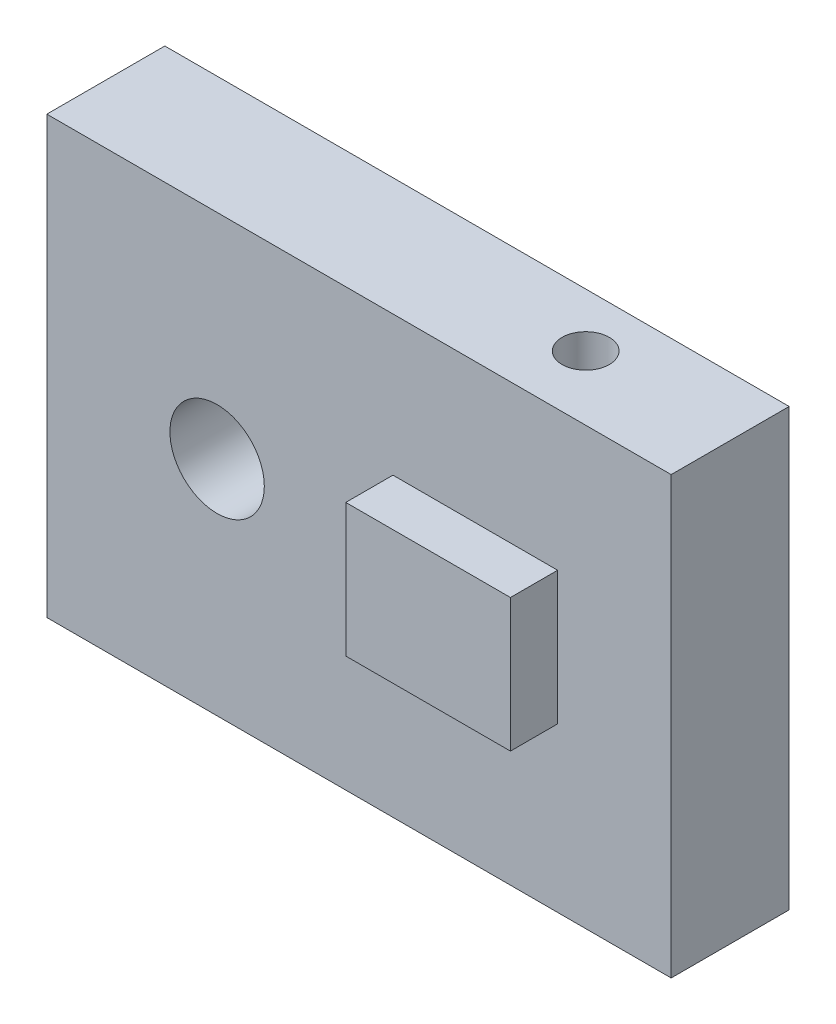
ISO-10303-21;
HEADER;
FILE_DESCRIPTION(('STEP AP214'),'2;1');
FILE_NAME('part.step','',(''),(''),'','','');
FILE_SCHEMA(('AUTOMOTIVE_DESIGN { 1 0 10303 214 1 1 1 1 }'));
ENDSEC;
DATA;
#1=APPLICATION_CONTEXT('core data for automotive mechanical design processes');
#2=APPLICATION_PROTOCOL_DEFINITION('international standard','automotive_design',2000,#1);
#3=PRODUCT_CONTEXT('',#1,'mechanical');
#4=PRODUCT('Part','Part','',(#3));
#5=PRODUCT_RELATED_PRODUCT_CATEGORY('part','',(#4));
#6=PRODUCT_DEFINITION_FORMATION('','',#4);
#7=PRODUCT_DEFINITION_CONTEXT('part definition',#1,'design');
#8=PRODUCT_DEFINITION('design','',#6,#7);
#9=PRODUCT_DEFINITION_SHAPE('','',#8);
#10=(LENGTH_UNIT() NAMED_UNIT(*) SI_UNIT(.MILLI.,.METRE.));
#11=(NAMED_UNIT(*) PLANE_ANGLE_UNIT() SI_UNIT($,.RADIAN.));
#12=(NAMED_UNIT(*) SI_UNIT($,.STERADIAN.) SOLID_ANGLE_UNIT());
#13=UNCERTAINTY_MEASURE_WITH_UNIT(LENGTH_MEASURE(1.E-05),#10,'distance_accuracy_value','');
#14=(GEOMETRIC_REPRESENTATION_CONTEXT(3) GLOBAL_UNCERTAINTY_ASSIGNED_CONTEXT((#13)) GLOBAL_UNIT_ASSIGNED_CONTEXT((#10,
#11,#12)) REPRESENTATION_CONTEXT('',''));
#15=CARTESIAN_POINT('',(0.,0.,0.));
#16=DIRECTION('',(0.,0.,1.));
#17=DIRECTION('',(1.,0.,0.));
#18=AXIS2_PLACEMENT_3D('',#15,#16,#17);
#19=CARTESIAN_POINT('',(0.,0.,25.));
#20=DIRECTION('',(0.,0.,1.));
#21=DIRECTION('',(1.,0.,0.));
#22=AXIS2_PLACEMENT_3D('',#19,#20,#21);
#23=PLANE('',#22);
#24=CARTESIAN_POINT('',(-30.0599732705231,0.936294249409827,25.));
#25=DIRECTION('',(0.,0.,1.));
#26=DIRECTION('',(1.,0.,0.));
#27=AXIS2_PLACEMENT_3D('',#24,#25,#26);
#28=CIRCLE('',#27,10.);
#29=CARTESIAN_POINT('',(-20.0599732705231,0.936294249409827,25.));
#30=VERTEX_POINT('',#29);
#31=EDGE_CURVE('E156',#30,#30,#28,.T.);
#32=ORIENTED_EDGE('',*,*,#31,.F.);
#33=EDGE_LOOP('',(#32));
#34=FACE_BOUND('',#33,.T.);
#35=DIRECTION('',(0.,1.,0.));
#36=VECTOR('',#35,1.);
#37=CARTESIAN_POINT('',(66.1380194985695,46.1841977518339,25.));
#38=LINE('',#37,#36);
#39=CARTESIAN_POINT('',(66.1380194985695,-46.1841977518339,25.));
#40=VERTEX_POINT('',#39);
#41=CARTESIAN_POINT('',(66.1380194985695,46.1841977518339,25.));
#42=VERTEX_POINT('',#41);
#43=EDGE_CURVE('E163',#40,#42,#38,.T.);
#44=ORIENTED_EDGE('',*,*,#43,.T.);
#45=DIRECTION('',(-1.,0.,0.));
#46=VECTOR('',#45,1.);
#47=CARTESIAN_POINT('',(-66.1380194985695,46.1841977518339,25.));
#48=LINE('',#47,#46);
#49=CARTESIAN_POINT('',(-66.1380194985695,46.1841977518339,25.));
#50=VERTEX_POINT('',#49);
#51=EDGE_CURVE('E99',#42,#50,#48,.T.);
#52=ORIENTED_EDGE('',*,*,#51,.T.);
#53=DIRECTION('',(0.,-1.,0.));
#54=VECTOR('',#53,1.);
#55=CARTESIAN_POINT('',(-66.1380194985695,46.1841977518339,25.));
#56=LINE('',#55,#54);
#57=CARTESIAN_POINT('',(-66.1380194985695,-46.1841977518339,25.));
#58=VERTEX_POINT('',#57);
#59=EDGE_CURVE('E166',#50,#58,#56,.T.);
#60=ORIENTED_EDGE('',*,*,#59,.T.);
#61=DIRECTION('',(1.,0.,0.));
#62=VECTOR('',#61,1.);
#63=CARTESIAN_POINT('',(-66.1380194985695,-46.1841977518339,25.));
#64=LINE('',#63,#62);
#65=EDGE_CURVE('E71',#58,#40,#64,.T.);
#66=ORIENTED_EDGE('',*,*,#65,.T.);
#67=EDGE_LOOP('',(#44,#52,#60,#66));
#68=FACE_BOUND('',#67,.T.);
#69=DIRECTION('',(-1.,0.,0.));
#70=VECTOR('',#69,1.);
#71=CARTESIAN_POINT('',(7.19468212704327,16.6069032658465,25.));
#72=LINE('',#71,#70);
#73=CARTESIAN_POINT('',(42.0839625787323,16.6069032658465,25.));
#74=VERTEX_POINT('',#73);
#75=CARTESIAN_POINT('',(7.19468212704327,16.6069032658465,25.));
#76=VERTEX_POINT('',#75);
#77=EDGE_CURVE('E324',#74,#76,#72,.T.);
#78=ORIENTED_EDGE('',*,*,#77,.F.);
#79=DIRECTION('',(0.,1.,0.));
#80=VECTOR('',#79,1.);
#81=CARTESIAN_POINT('',(42.0839625787323,16.6069032658465,25.));
#82=LINE('',#81,#80);
#83=CARTESIAN_POINT('',(42.0839625787323,-11.5804815058572,25.));
#84=VERTEX_POINT('',#83);
#85=EDGE_CURVE('E144',#84,#74,#82,.T.);
#86=ORIENTED_EDGE('',*,*,#85,.F.);
#87=DIRECTION('',(1.,0.,0.));
#88=VECTOR('',#87,1.);
#89=CARTESIAN_POINT('',(7.19468212704327,-11.5804815058572,25.));
#90=LINE('',#89,#88);
#91=CARTESIAN_POINT('',(7.19468212704327,-11.5804815058572,25.));
#92=VERTEX_POINT('',#91);
#93=EDGE_CURVE('E140',#92,#84,#90,.T.);
#94=ORIENTED_EDGE('',*,*,#93,.F.);
#95=DIRECTION('',(0.,-1.,0.));
#96=VECTOR('',#95,1.);
#97=CARTESIAN_POINT('',(7.19468212704327,16.6069032658465,25.));
#98=LINE('',#97,#96);
#99=EDGE_CURVE('E321',#76,#92,#98,.T.);
#100=ORIENTED_EDGE('',*,*,#99,.F.);
#101=EDGE_LOOP('',(#78,#86,#94,#100));
#102=FACE_BOUND('',#101,.T.);
#103=ADVANCED_FACE('F47',(#34,#68,#102),#23,.T.);
#104=CARTESIAN_POINT('',(66.1380194985695,46.1841977518339,25.));
#105=DIRECTION('',(-1.,0.,0.));
#106=DIRECTION('',(0.,0.,1.));
#107=AXIS2_PLACEMENT_3D('',#104,#105,#106);
#108=PLANE('',#107);
#109=DIRECTION('',(0.,1.,0.));
#110=VECTOR('',#109,1.);
#111=CARTESIAN_POINT('',(66.1380194985695,46.1841977518339,0.));
#112=LINE('',#111,#110);
#113=CARTESIAN_POINT('',(66.1380194985695,-46.1841977518339,0.));
#114=VERTEX_POINT('',#113);
#115=CARTESIAN_POINT('',(66.1380194985695,46.1841977518339,0.));
#116=VERTEX_POINT('',#115);
#117=EDGE_CURVE('E162',#114,#116,#112,.T.);
#118=ORIENTED_EDGE('',*,*,#117,.T.);
#119=DIRECTION('',(0.,0.,-1.));
#120=VECTOR('',#119,1.);
#121=CARTESIAN_POINT('',(66.1380194985695,46.1841977518339,25.));
#122=LINE('',#121,#120);
#123=EDGE_CURVE('E11',#42,#116,#122,.T.);
#124=ORIENTED_EDGE('',*,*,#123,.F.);
#125=ORIENTED_EDGE('',*,*,#43,.F.);
#126=DIRECTION('',(0.,0.,-1.));
#127=VECTOR('',#126,1.);
#128=CARTESIAN_POINT('',(66.1380194985695,-46.1841977518339,25.));
#129=LINE('',#128,#127);
#130=EDGE_CURVE('E169',#40,#114,#129,.T.);
#131=ORIENTED_EDGE('',*,*,#130,.T.);
#132=EDGE_LOOP('',(#118,#124,#125,#131));
#133=FACE_BOUND('',#132,.T.);
#134=ADVANCED_FACE('F49',(#133),#108,.F.);
#135=CARTESIAN_POINT('',(-66.1380194985695,46.1841977518339,25.));
#136=DIRECTION('',(0.,-1.,0.));
#137=DIRECTION('',(0.,0.,-1.));
#138=AXIS2_PLACEMENT_3D('',#135,#136,#137);
#139=PLANE('',#138);
#140=CARTESIAN_POINT('',(34.3964940046314,46.1841977518339,11.3665911717668));
#141=DIRECTION('',(0.,1.,0.));
#142=DIRECTION('',(0.,0.,1.));
#143=AXIS2_PLACEMENT_3D('',#140,#141,#142);
#144=CIRCLE('',#143,5.);
#145=CARTESIAN_POINT('',(34.3964940046314,46.1841977518339,16.3665911717668));
#146=VERTEX_POINT('',#145);
#147=EDGE_CURVE('E146',#146,#146,#144,.T.);
#148=ORIENTED_EDGE('',*,*,#147,.F.);
#149=EDGE_LOOP('',(#148));
#150=FACE_BOUND('',#149,.T.);
#151=DIRECTION('',(-1.,0.,0.));
#152=VECTOR('',#151,1.);
#153=CARTESIAN_POINT('',(-66.1380194985695,46.1841977518339,0.));
#154=LINE('',#153,#152);
#155=CARTESIAN_POINT('',(-66.1380194985695,46.1841977518339,0.));
#156=VERTEX_POINT('',#155);
#157=EDGE_CURVE('E172',#116,#156,#154,.T.);
#158=ORIENTED_EDGE('',*,*,#157,.T.);
#159=DIRECTION('',(0.,0.,-1.));
#160=VECTOR('',#159,1.);
#161=CARTESIAN_POINT('',(-66.1380194985695,46.1841977518339,25.));
#162=LINE('',#161,#160);
#163=EDGE_CURVE('E55',#50,#156,#162,.T.);
#164=ORIENTED_EDGE('',*,*,#163,.F.);
#165=ORIENTED_EDGE('',*,*,#51,.F.);
#166=ORIENTED_EDGE('',*,*,#123,.T.);
#167=EDGE_LOOP('',(#158,#164,#165,#166));
#168=FACE_BOUND('',#167,.T.);
#169=ADVANCED_FACE('F204',(#150,#168),#139,.F.);
#170=CARTESIAN_POINT('',(-66.1380194985695,46.1841977518339,25.));
#171=DIRECTION('',(1.,0.,0.));
#172=DIRECTION('',(0.,0.,-1.));
#173=AXIS2_PLACEMENT_3D('',#170,#171,#172);
#174=PLANE('',#173);
#175=DIRECTION('',(0.,-1.,0.));
#176=VECTOR('',#175,1.);
#177=CARTESIAN_POINT('',(-66.1380194985695,46.1841977518339,0.));
#178=LINE('',#177,#176);
#179=CARTESIAN_POINT('',(-66.1380194985695,-46.1841977518339,0.));
#180=VERTEX_POINT('',#179);
#181=EDGE_CURVE('E174',#156,#180,#178,.T.);
#182=ORIENTED_EDGE('',*,*,#181,.T.);
#183=DIRECTION('',(0.,0.,-1.));
#184=VECTOR('',#183,1.);
#185=CARTESIAN_POINT('',(-66.1380194985695,-46.1841977518339,25.));
#186=LINE('',#185,#184);
#187=EDGE_CURVE('E178',#58,#180,#186,.T.);
#188=ORIENTED_EDGE('',*,*,#187,.F.);
#189=ORIENTED_EDGE('',*,*,#59,.F.);
#190=ORIENTED_EDGE('',*,*,#163,.T.);
#191=EDGE_LOOP('',(#182,#188,#189,#190));
#192=FACE_BOUND('',#191,.T.);
#193=ADVANCED_FACE('F183',(#192),#174,.F.);
#194=CARTESIAN_POINT('',(-66.1380194985695,-46.1841977518339,25.));
#195=DIRECTION('',(0.,1.,0.));
#196=DIRECTION('',(0.,0.,1.));
#197=AXIS2_PLACEMENT_3D('',#194,#195,#196);
#198=PLANE('',#197);
#199=CARTESIAN_POINT('',(34.3964940046314,-46.1841977518339,11.3665911717668));
#200=DIRECTION('',(0.,1.,0.));
#201=DIRECTION('',(0.,0.,1.));
#202=AXIS2_PLACEMENT_3D('',#199,#200,#201);
#203=CIRCLE('',#202,4.99999999999999);
#204=CARTESIAN_POINT('',(34.3964940046314,-46.1841977518339,16.3665911717668));
#205=VERTEX_POINT('',#204);
#206=EDGE_CURVE('E149',#205,#205,#203,.T.);
#207=ORIENTED_EDGE('',*,*,#206,.T.);
#208=EDGE_LOOP('',(#207));
#209=FACE_BOUND('',#208,.T.);
#210=DIRECTION('',(1.,0.,0.));
#211=VECTOR('',#210,1.);
#212=CARTESIAN_POINT('',(-66.1380194985695,-46.1841977518339,0.));
#213=LINE('',#212,#211);
#214=EDGE_CURVE('E92',#180,#114,#213,.T.);
#215=ORIENTED_EDGE('',*,*,#214,.T.);
#216=ORIENTED_EDGE('',*,*,#130,.F.);
#217=ORIENTED_EDGE('',*,*,#65,.F.);
#218=ORIENTED_EDGE('',*,*,#187,.T.);
#219=EDGE_LOOP('',(#215,#216,#217,#218));
#220=FACE_BOUND('',#219,.T.);
#221=ADVANCED_FACE('F191',(#209,#220),#198,.F.);
#222=CARTESIAN_POINT('',(0.,0.,0.));
#223=DIRECTION('',(0.,0.,1.));
#224=DIRECTION('',(1.,0.,0.));
#225=AXIS2_PLACEMENT_3D('',#222,#223,#224);
#226=PLANE('',#225);
#227=CARTESIAN_POINT('',(-30.0599732705231,0.936294249409827,0.));
#228=DIRECTION('',(0.,0.,1.));
#229=DIRECTION('',(1.,0.,0.));
#230=AXIS2_PLACEMENT_3D('',#227,#228,#229);
#231=CIRCLE('',#230,10.);
#232=CARTESIAN_POINT('',(-20.0599732705231,0.936294249409827,0.));
#233=VERTEX_POINT('',#232);
#234=EDGE_CURVE('E159',#233,#233,#231,.T.);
#235=ORIENTED_EDGE('',*,*,#234,.T.);
#236=EDGE_LOOP('',(#235));
#237=FACE_BOUND('',#236,.T.);
#238=ORIENTED_EDGE('',*,*,#117,.F.);
#239=ORIENTED_EDGE('',*,*,#214,.F.);
#240=ORIENTED_EDGE('',*,*,#181,.F.);
#241=ORIENTED_EDGE('',*,*,#157,.F.);
#242=EDGE_LOOP('',(#238,#239,#240,#241));
#243=FACE_BOUND('',#242,.T.);
#244=ADVANCED_FACE('F187',(#237,#243),#226,.F.);
#245=CARTESIAN_POINT('',(-30.0599732705231,0.936294249409827,25.));
#246=DIRECTION('',(0.,0.,1.));
#247=DIRECTION('',(1.,0.,0.));
#248=AXIS2_PLACEMENT_3D('',#245,#246,#247);
#249=CYLINDRICAL_SURFACE('',#248,10.);
#250=ORIENTED_EDGE('',*,*,#234,.F.);
#251=EDGE_LOOP('',(#250));
#252=FACE_BOUND('',#251,.T.);
#253=ORIENTED_EDGE('',*,*,#31,.T.);
#254=EDGE_LOOP('',(#253));
#255=FACE_BOUND('',#254,.T.);
#256=ADVANCED_FACE('F200',(#252,#255),#249,.F.);
#257=CARTESIAN_POINT('',(34.3964940046314,46.1841977518339,11.3665911717668));
#258=DIRECTION('',(0.,1.,0.));
#259=DIRECTION('',(0.,0.,1.));
#260=AXIS2_PLACEMENT_3D('',#257,#258,#259);
#261=CYLINDRICAL_SURFACE('',#260,5.);
#262=ORIENTED_EDGE('',*,*,#206,.F.);
#263=EDGE_LOOP('',(#262));
#264=FACE_BOUND('',#263,.T.);
#265=ORIENTED_EDGE('',*,*,#147,.T.);
#266=EDGE_LOOP('',(#265));
#267=FACE_BOUND('',#266,.T.);
#268=ADVANCED_FACE('F217',(#264,#267),#261,.F.);
#269=CARTESIAN_POINT('',(42.0839625787323,16.6069032658465,35.));
#270=DIRECTION('',(-1.,0.,0.));
#271=DIRECTION('',(0.,0.,1.));
#272=AXIS2_PLACEMENT_3D('',#269,#270,#271);
#273=PLANE('',#272);
#274=ORIENTED_EDGE('',*,*,#85,.T.);
#275=DIRECTION('',(0.,0.,-1.));
#276=VECTOR('',#275,1.);
#277=CARTESIAN_POINT('',(42.0839625787323,16.6069032658465,35.));
#278=LINE('',#277,#276);
#279=CARTESIAN_POINT('',(42.0839625787323,16.6069032658465,35.));
#280=VERTEX_POINT('',#279);
#281=EDGE_CURVE('E125',#280,#74,#278,.T.);
#282=ORIENTED_EDGE('',*,*,#281,.F.);
#283=DIRECTION('',(0.,1.,0.));
#284=VECTOR('',#283,1.);
#285=CARTESIAN_POINT('',(42.0839625787323,16.6069032658465,35.));
#286=LINE('',#285,#284);
#287=CARTESIAN_POINT('',(42.0839625787323,-11.5804815058572,35.));
#288=VERTEX_POINT('',#287);
#289=EDGE_CURVE('E132',#288,#280,#286,.T.);
#290=ORIENTED_EDGE('',*,*,#289,.F.);
#291=DIRECTION('',(0.,0.,-1.));
#292=VECTOR('',#291,1.);
#293=CARTESIAN_POINT('',(42.0839625787323,-11.5804815058572,35.));
#294=LINE('',#293,#292);
#295=EDGE_CURVE('E318',#288,#84,#294,.T.);
#296=ORIENTED_EDGE('',*,*,#295,.T.);
#297=EDGE_LOOP('',(#274,#282,#290,#296));
#298=FACE_BOUND('',#297,.T.);
#299=ADVANCED_FACE('F142',(#298),#273,.F.);
#300=CARTESIAN_POINT('',(7.19468212704327,16.6069032658465,35.));
#301=DIRECTION('',(0.,-1.,0.));
#302=DIRECTION('',(0.,0.,-1.));
#303=AXIS2_PLACEMENT_3D('',#300,#301,#302);
#304=PLANE('',#303);
#305=ORIENTED_EDGE('',*,*,#77,.T.);
#306=DIRECTION('',(0.,0.,-1.));
#307=VECTOR('',#306,1.);
#308=CARTESIAN_POINT('',(7.19468212704327,16.6069032658465,35.));
#309=LINE('',#308,#307);
#310=CARTESIAN_POINT('',(7.19468212704327,16.6069032658465,35.));
#311=VERTEX_POINT('',#310);
#312=EDGE_CURVE('E128',#311,#76,#309,.T.);
#313=ORIENTED_EDGE('',*,*,#312,.F.);
#314=DIRECTION('',(-1.,0.,0.));
#315=VECTOR('',#314,1.);
#316=CARTESIAN_POINT('',(7.19468212704327,16.6069032658465,35.));
#317=LINE('',#316,#315);
#318=EDGE_CURVE('E121',#280,#311,#317,.T.);
#319=ORIENTED_EDGE('',*,*,#318,.F.);
#320=ORIENTED_EDGE('',*,*,#281,.T.);
#321=EDGE_LOOP('',(#305,#313,#319,#320));
#322=FACE_BOUND('',#321,.T.);
#323=ADVANCED_FACE('F123',(#322),#304,.F.);
#324=CARTESIAN_POINT('',(7.19468212704327,16.6069032658465,35.));
#325=DIRECTION('',(1.,0.,0.));
#326=DIRECTION('',(0.,0.,-1.));
#327=AXIS2_PLACEMENT_3D('',#324,#325,#326);
#328=PLANE('',#327);
#329=ORIENTED_EDGE('',*,*,#99,.T.);
#330=DIRECTION('',(0.,0.,-1.));
#331=VECTOR('',#330,1.);
#332=CARTESIAN_POINT('',(7.19468212704327,-11.5804815058572,35.));
#333=LINE('',#332,#331);
#334=CARTESIAN_POINT('',(7.19468212704327,-11.5804815058572,35.));
#335=VERTEX_POINT('',#334);
#336=EDGE_CURVE('E62',#335,#92,#333,.T.);
#337=ORIENTED_EDGE('',*,*,#336,.F.);
#338=DIRECTION('',(0.,-1.,0.));
#339=VECTOR('',#338,1.);
#340=CARTESIAN_POINT('',(7.19468212704327,16.6069032658465,35.));
#341=LINE('',#340,#339);
#342=EDGE_CURVE('E131',#311,#335,#341,.T.);
#343=ORIENTED_EDGE('',*,*,#342,.F.);
#344=ORIENTED_EDGE('',*,*,#312,.T.);
#345=EDGE_LOOP('',(#329,#337,#343,#344));
#346=FACE_BOUND('',#345,.T.);
#347=ADVANCED_FACE('F225',(#346),#328,.F.);
#348=CARTESIAN_POINT('',(7.19468212704327,-11.5804815058572,35.));
#349=DIRECTION('',(0.,1.,0.));
#350=DIRECTION('',(0.,0.,1.));
#351=AXIS2_PLACEMENT_3D('',#348,#349,#350);
#352=PLANE('',#351);
#353=ORIENTED_EDGE('',*,*,#93,.T.);
#354=ORIENTED_EDGE('',*,*,#295,.F.);
#355=DIRECTION('',(1.,0.,0.));
#356=VECTOR('',#355,1.);
#357=CARTESIAN_POINT('',(7.19468212704327,-11.5804815058572,35.));
#358=LINE('',#357,#356);
#359=EDGE_CURVE('E136',#335,#288,#358,.T.);
#360=ORIENTED_EDGE('',*,*,#359,.F.);
#361=ORIENTED_EDGE('',*,*,#336,.T.);
#362=EDGE_LOOP('',(#353,#354,#360,#361));
#363=FACE_BOUND('',#362,.T.);
#364=ADVANCED_FACE('F228',(#363),#352,.F.);
#365=CARTESIAN_POINT('',(0.,0.,35.));
#366=DIRECTION('',(0.,0.,1.));
#367=DIRECTION('',(1.,0.,0.));
#368=AXIS2_PLACEMENT_3D('',#365,#366,#367);
#369=PLANE('',#368);
#370=ORIENTED_EDGE('',*,*,#289,.T.);
#371=ORIENTED_EDGE('',*,*,#318,.T.);
#372=ORIENTED_EDGE('',*,*,#342,.T.);
#373=ORIENTED_EDGE('',*,*,#359,.T.);
#374=EDGE_LOOP('',(#370,#371,#372,#373));
#375=FACE_BOUND('',#374,.T.);
#376=ADVANCED_FACE('F135',(#375),#369,.T.);
#377=CLOSED_SHELL('',(#103,#134,#169,#193,#221,#244,#256,#268,#299,#323,#347,#364,#376));
#378=MANIFOLD_SOLID_BREP('B2',#377);
#379=ADVANCED_BREP_SHAPE_REPRESENTATION('',(#18,#378),#14);
#380=SHAPE_DEFINITION_REPRESENTATION(#9,#379);
ENDSEC;
END-ISO-10303-21;
